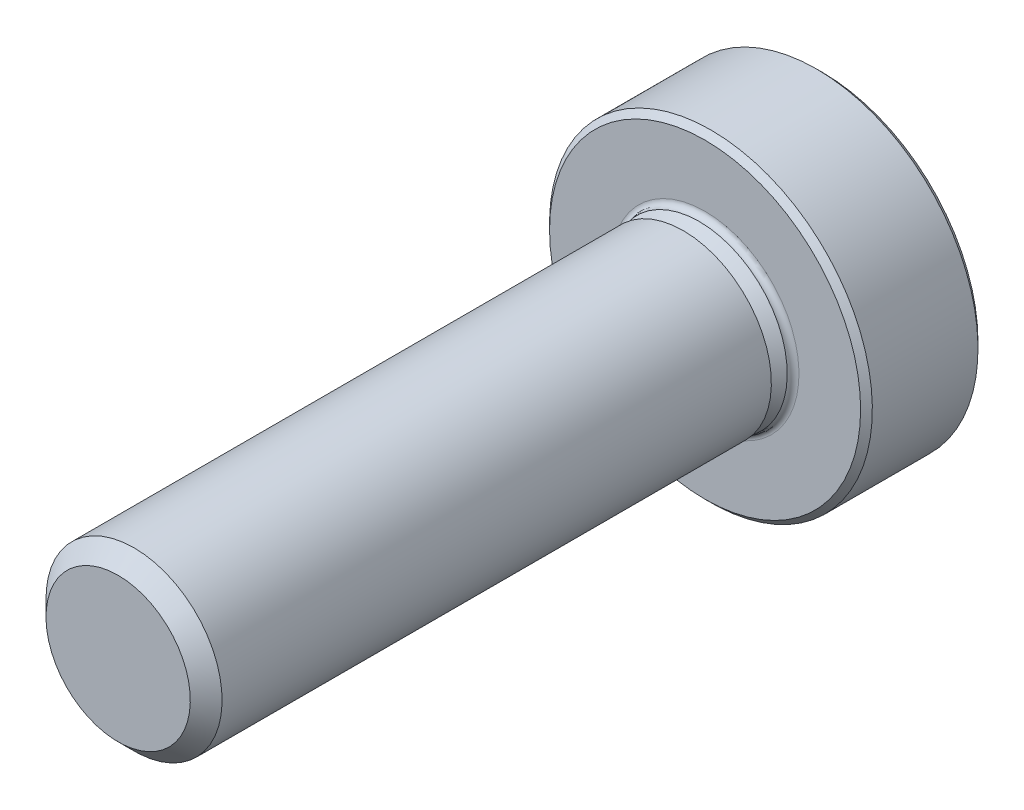
ISO-10303-21;
HEADER;
FILE_DESCRIPTION(('STEP AP214'),'2;1');
FILE_NAME('part.step','',(''),(''),'','','');
FILE_SCHEMA(('AUTOMOTIVE_DESIGN { 1 0 10303 214 1 1 1 1 }'));
ENDSEC;
DATA;
#1=APPLICATION_CONTEXT('core data for automotive mechanical design processes');
#2=APPLICATION_PROTOCOL_DEFINITION('international standard','automotive_design',2000,#1);
#3=PRODUCT_CONTEXT('',#1,'mechanical');
#4=PRODUCT('Part','Part','',(#3));
#5=PRODUCT_RELATED_PRODUCT_CATEGORY('part','',(#4));
#6=PRODUCT_DEFINITION_FORMATION('','',#4);
#7=PRODUCT_DEFINITION_CONTEXT('part definition',#1,'design');
#8=PRODUCT_DEFINITION('design','',#6,#7);
#9=PRODUCT_DEFINITION_SHAPE('','',#8);
#10=(LENGTH_UNIT() NAMED_UNIT(*) SI_UNIT(.MILLI.,.METRE.));
#11=(NAMED_UNIT(*) PLANE_ANGLE_UNIT() SI_UNIT($,.RADIAN.));
#12=(NAMED_UNIT(*) SI_UNIT($,.STERADIAN.) SOLID_ANGLE_UNIT());
#13=UNCERTAINTY_MEASURE_WITH_UNIT(LENGTH_MEASURE(1.E-05),#10,'distance_accuracy_value','');
#14=(GEOMETRIC_REPRESENTATION_CONTEXT(3) GLOBAL_UNCERTAINTY_ASSIGNED_CONTEXT((#13)) GLOBAL_UNIT_ASSIGNED_CONTEXT((#10,
#11,#12)) REPRESENTATION_CONTEXT('',''));
#15=CARTESIAN_POINT('',(0.,0.,0.));
#16=DIRECTION('',(0.,0.,1.));
#17=DIRECTION('',(1.,0.,0.));
#18=AXIS2_PLACEMENT_3D('',#15,#16,#17);
#19=CARTESIAN_POINT('',(0.,0.6146875,10.));
#20=DIRECTION('',(0.,0.,1.));
#21=DIRECTION('',(0.,1.,0.));
#22=AXIS2_PLACEMENT_3D('',#19,#20,#21);
#23=PLANE('',#22);
#24=CARTESIAN_POINT('',(0.,0.,10.));
#25=DIRECTION('',(0.,0.,1.));
#26=DIRECTION('',(0.,1.,0.));
#27=AXIS2_PLACEMENT_3D('',#24,#25,#26);
#28=CIRCLE('',#27,1.229375);
#29=CARTESIAN_POINT('',(0.,1.229375,10.));
#30=VERTEX_POINT('',#29);
#31=EDGE_CURVE('E10',#30,#30,#28,.T.);
#32=ORIENTED_EDGE('',*,*,#31,.T.);
#33=EDGE_LOOP('',(#32));
#34=FACE_BOUND('',#33,.T.);
#35=ADVANCED_FACE('F15',(#34),#23,.T.);
#36=CARTESIAN_POINT('',(0.,0.,9.8646875));
#37=DIRECTION('',(0.,0.,-1.));
#38=DIRECTION('',(0.,1.,0.));
#39=AXIS2_PLACEMENT_3D('',#36,#37,#38);
#40=CONICAL_SURFACE('',#39,1.3646875,0.785398163397447);
#41=CARTESIAN_POINT('',(0.,0.,9.729375));
#42=DIRECTION('',(0.,0.,1.));
#43=DIRECTION('',(0.,1.,0.));
#44=AXIS2_PLACEMENT_3D('',#41,#42,#43);
#45=CIRCLE('',#44,1.5);
#46=CARTESIAN_POINT('',(0.,1.5,9.729375));
#47=VERTEX_POINT('',#46);
#48=EDGE_CURVE('E27',#47,#47,#45,.T.);
#49=ORIENTED_EDGE('',*,*,#48,.T.);
#50=EDGE_LOOP('',(#49));
#51=FACE_BOUND('',#50,.T.);
#52=ORIENTED_EDGE('',*,*,#31,.F.);
#53=EDGE_LOOP('',(#52));
#54=FACE_BOUND('',#53,.T.);
#55=ADVANCED_FACE('F322',(#51,#54),#40,.T.);
#56=CARTESIAN_POINT('',(0.,0.,5.05));
#57=DIRECTION('',(0.,0.,-1.));
#58=DIRECTION('',(0.,1.,0.));
#59=AXIS2_PLACEMENT_3D('',#56,#57,#58);
#60=CYLINDRICAL_SURFACE('',#59,1.5);
#61=CARTESIAN_POINT('',(0.,0.,0.370625));
#62=DIRECTION('',(0.,0.,1.));
#63=DIRECTION('',(0.,1.,0.));
#64=AXIS2_PLACEMENT_3D('',#61,#62,#63);
#65=CIRCLE('',#64,1.5);
#66=CARTESIAN_POINT('',(0.,1.5,0.370625));
#67=VERTEX_POINT('',#66);
#68=EDGE_CURVE('E161',#67,#67,#65,.T.);
#69=ORIENTED_EDGE('',*,*,#68,.T.);
#70=EDGE_LOOP('',(#69));
#71=FACE_BOUND('',#70,.T.);
#72=ORIENTED_EDGE('',*,*,#48,.F.);
#73=EDGE_LOOP('',(#72));
#74=FACE_BOUND('',#73,.T.);
#75=ADVANCED_FACE('F326',(#71,#74),#60,.T.);
#76=CARTESIAN_POINT('',(0.,1.3646875,0.370625));
#77=DIRECTION('',(0.,0.,-1.));
#78=DIRECTION('',(0.,-1.,0.));
#79=AXIS2_PLACEMENT_3D('',#76,#77,#78);
#80=PLANE('',#79);
#81=CARTESIAN_POINT('',(0.,0.,0.370625));
#82=DIRECTION('',(0.,0.,1.));
#83=DIRECTION('',(0.,1.,0.));
#84=AXIS2_PLACEMENT_3D('',#81,#82,#83);
#85=CIRCLE('',#84,1.229375);
#86=CARTESIAN_POINT('',(0.,1.229375,0.370625));
#87=VERTEX_POINT('',#86);
#88=EDGE_CURVE('E154',#87,#87,#85,.T.);
#89=ORIENTED_EDGE('',*,*,#88,.T.);
#90=EDGE_LOOP('',(#89));
#91=FACE_BOUND('',#90,.T.);
#92=ORIENTED_EDGE('',*,*,#68,.F.);
#93=EDGE_LOOP('',(#92));
#94=FACE_BOUND('',#93,.T.);
#95=ADVANCED_FACE('F338',(#91,#94),#80,.T.);
#96=CARTESIAN_POINT('',(0.,0.,0.235312499999997));
#97=DIRECTION('',(0.,0.,-1.));
#98=DIRECTION('',(0.,1.,0.));
#99=AXIS2_PLACEMENT_3D('',#96,#97,#98);
#100=CONICAL_SURFACE('',#99,1.3646875,0.785398163397448);
#101=CARTESIAN_POINT('',(0.,0.,0.0999999999999943));
#102=DIRECTION('',(0.,0.,1.));
#103=DIRECTION('',(0.,1.,0.));
#104=AXIS2_PLACEMENT_3D('',#101,#102,#103);
#105=CIRCLE('',#104,1.5);
#106=CARTESIAN_POINT('',(0.,1.5,0.0999999999999943));
#107=VERTEX_POINT('',#106);
#108=EDGE_CURVE('E151',#107,#107,#105,.T.);
#109=ORIENTED_EDGE('',*,*,#108,.T.);
#110=EDGE_LOOP('',(#109));
#111=FACE_BOUND('',#110,.T.);
#112=ORIENTED_EDGE('',*,*,#88,.F.);
#113=EDGE_LOOP('',(#112));
#114=FACE_BOUND('',#113,.T.);
#115=ADVANCED_FACE('F335',(#111,#114),#100,.T.);
#116=CARTESIAN_POINT('',(0.,0.,0.1));
#117=DIRECTION('',(0.,0.,1.));
#118=DIRECTION('',(1.,0.,0.));
#119=AXIS2_PLACEMENT_3D('',#116,#117,#118);
#120=TOROIDAL_SURFACE('',#119,1.6,0.1);
#121=CARTESIAN_POINT('',(0.,0.,0.));
#122=DIRECTION('',(0.,0.,1.));
#123=DIRECTION('',(0.,1.,0.));
#124=AXIS2_PLACEMENT_3D('',#121,#122,#123);
#125=CIRCLE('',#124,1.6);
#126=CARTESIAN_POINT('',(0.,1.6,0.));
#127=VERTEX_POINT('',#126);
#128=EDGE_CURVE('E147',#127,#127,#125,.T.);
#129=ORIENTED_EDGE('',*,*,#128,.T.);
#130=EDGE_LOOP('',(#129));
#131=FACE_BOUND('',#130,.T.);
#132=ORIENTED_EDGE('',*,*,#108,.F.);
#133=EDGE_LOOP('',(#132));
#134=FACE_BOUND('',#133,.T.);
#135=ADVANCED_FACE('F148',(#131,#134),#120,.F.);
#136=CARTESIAN_POINT('',(0.,2.125,0.));
#137=DIRECTION('',(0.,0.,1.));
#138=DIRECTION('',(0.,1.,0.));
#139=AXIS2_PLACEMENT_3D('',#136,#137,#138);
#140=PLANE('',#139);
#141=CARTESIAN_POINT('',(0.,0.,0.));
#142=DIRECTION('',(0.,0.,1.));
#143=DIRECTION('',(0.,1.,0.));
#144=AXIS2_PLACEMENT_3D('',#141,#142,#143);
#145=CIRCLE('',#144,2.65);
#146=CARTESIAN_POINT('',(0.,2.65,0.));
#147=VERTEX_POINT('',#146);
#148=EDGE_CURVE('E152',#147,#147,#145,.T.);
#149=ORIENTED_EDGE('',*,*,#148,.T.);
#150=EDGE_LOOP('',(#149));
#151=FACE_BOUND('',#150,.T.);
#152=ORIENTED_EDGE('',*,*,#128,.F.);
#153=EDGE_LOOP('',(#152));
#154=FACE_BOUND('',#153,.T.);
#155=ADVANCED_FACE('F342',(#151,#154),#140,.T.);
#156=CARTESIAN_POINT('',(0.,0.,-0.05));
#157=DIRECTION('',(0.,0.,-1.));
#158=DIRECTION('',(0.,1.,0.));
#159=AXIS2_PLACEMENT_3D('',#156,#157,#158);
#160=CONICAL_SURFACE('',#159,2.7,0.785398163397449);
#161=CARTESIAN_POINT('',(0.,0.,-0.1));
#162=DIRECTION('',(0.,0.,1.));
#163=DIRECTION('',(0.,1.,0.));
#164=AXIS2_PLACEMENT_3D('',#161,#162,#163);
#165=CIRCLE('',#164,2.75);
#166=CARTESIAN_POINT('',(0.,2.75,-0.1));
#167=VERTEX_POINT('',#166);
#168=EDGE_CURVE('E156',#167,#167,#165,.T.);
#169=ORIENTED_EDGE('',*,*,#168,.T.);
#170=EDGE_LOOP('',(#169));
#171=FACE_BOUND('',#170,.T.);
#172=ORIENTED_EDGE('',*,*,#148,.F.);
#173=EDGE_LOOP('',(#172));
#174=FACE_BOUND('',#173,.T.);
#175=ADVANCED_FACE('F345',(#171,#174),#160,.T.);
#176=CARTESIAN_POINT('',(0.,0.,-1.));
#177=DIRECTION('',(0.,0.,-1.));
#178=DIRECTION('',(0.,1.,0.));
#179=AXIS2_PLACEMENT_3D('',#176,#177,#178);
#180=CYLINDRICAL_SURFACE('',#179,2.75);
#181=CARTESIAN_POINT('',(0.,0.,-1.9));
#182=DIRECTION('',(0.,0.,1.));
#183=DIRECTION('',(0.,1.,0.));
#184=AXIS2_PLACEMENT_3D('',#181,#182,#183);
#185=CIRCLE('',#184,2.75);
#186=CARTESIAN_POINT('',(0.,2.75,-1.9));
#187=VERTEX_POINT('',#186);
#188=EDGE_CURVE('E168',#187,#187,#185,.T.);
#189=ORIENTED_EDGE('',*,*,#188,.T.);
#190=EDGE_LOOP('',(#189));
#191=FACE_BOUND('',#190,.T.);
#192=ORIENTED_EDGE('',*,*,#168,.F.);
#193=EDGE_LOOP('',(#192));
#194=FACE_BOUND('',#193,.T.);
#195=ADVANCED_FACE('F349',(#191,#194),#180,.T.);
#196=CARTESIAN_POINT('',(0.,0.,-1.95));
#197=DIRECTION('',(0.,0.,1.));
#198=DIRECTION('',(0.,1.,0.));
#199=AXIS2_PLACEMENT_3D('',#196,#197,#198);
#200=CONICAL_SURFACE('',#199,2.7,0.785398163397449);
#201=CARTESIAN_POINT('',(0.,0.,-2.));
#202=DIRECTION('',(0.,0.,1.));
#203=DIRECTION('',(0.,1.,0.));
#204=AXIS2_PLACEMENT_3D('',#201,#202,#203);
#205=CIRCLE('',#204,2.65);
#206=CARTESIAN_POINT('',(0.,2.65,-2.));
#207=VERTEX_POINT('',#206);
#208=EDGE_CURVE('E219',#207,#207,#205,.T.);
#209=ORIENTED_EDGE('',*,*,#208,.T.);
#210=EDGE_LOOP('',(#209));
#211=FACE_BOUND('',#210,.T.);
#212=ORIENTED_EDGE('',*,*,#188,.F.);
#213=EDGE_LOOP('',(#212));
#214=FACE_BOUND('',#213,.T.);
#215=ADVANCED_FACE('F351',(#211,#214),#200,.T.);
#216=CARTESIAN_POINT('',(0.,1.325,-2.));
#217=DIRECTION('',(0.,0.,-1.));
#218=DIRECTION('',(0.,-1.,0.));
#219=AXIS2_PLACEMENT_3D('',#216,#217,#218);
#220=PLANE('',#219);
#221=ORIENTED_EDGE('',*,*,#208,.F.);
#222=EDGE_LOOP('',(#221));
#223=FACE_BOUND('',#222,.T.);
#224=DIRECTION('',(-0.866025403784439,-0.5,0.));
#225=VECTOR('',#224,1.);
#226=CARTESIAN_POINT('',(-0.213129084996405,1.03165040378444,-2.));
#227=LINE('',#226,#225);
#228=CARTESIAN_POINT('',(-0.0196936524466905,1.14333040283783,-2.));
#229=VERTEX_POINT('',#228);
#230=CARTESIAN_POINT('',(-0.980306347553309,0.58872040473105,-2.));
#231=VERTEX_POINT('',#230);
#232=EDGE_CURVE('E162',#229,#231,#227,.T.);
#233=ORIENTED_EDGE('',*,*,#232,.T.);
#234=CARTESIAN_POINT('',(0.,0.,-2.));
#235=DIRECTION('',(0.,0.,1.));
#236=DIRECTION('',(0.,1.,0.));
#237=AXIS2_PLACEMENT_3D('',#234,#235,#236);
#238=CIRCLE('',#237,1.1435);
#239=CARTESIAN_POINT('',(-1.,0.554609998106778,-2.));
#240=VERTEX_POINT('',#239);
#241=EDGE_CURVE('E52',#231,#240,#238,.T.);
#242=ORIENTED_EDGE('',*,*,#241,.T.);
#243=DIRECTION('',(0.,-1.,0.));
#244=VECTOR('',#243,1.);
#245=CARTESIAN_POINT('',(-1.,0.6625,-2.));
#246=LINE('',#245,#244);
#247=CARTESIAN_POINT('',(-1.,-0.554609998106778,-2.));
#248=VERTEX_POINT('',#247);
#249=EDGE_CURVE('E202',#240,#248,#246,.T.);
#250=ORIENTED_EDGE('',*,*,#249,.T.);
#251=CARTESIAN_POINT('',(0.,0.,-2.));
#252=DIRECTION('',(0.,0.,1.));
#253=DIRECTION('',(0.,1.,0.));
#254=AXIS2_PLACEMENT_3D('',#251,#252,#253);
#255=CIRCLE('',#254,1.1435);
#256=CARTESIAN_POINT('',(-0.980306347553309,-0.58872040473105,-2.));
#257=VERTEX_POINT('',#256);
#258=EDGE_CURVE('E215',#248,#257,#255,.T.);
#259=ORIENTED_EDGE('',*,*,#258,.T.);
#260=DIRECTION('',(0.866025403784439,-0.5,0.));
#261=VECTOR('',#260,1.);
#262=CARTESIAN_POINT('',(-0.786870915003595,-0.700400403784438,-2.));
#263=LINE('',#262,#261);
#264=CARTESIAN_POINT('',(-0.0196936524466912,-1.14333040283783,-2.));
#265=VERTEX_POINT('',#264);
#266=EDGE_CURVE('E200',#257,#265,#263,.T.);
#267=ORIENTED_EDGE('',*,*,#266,.T.);
#268=CARTESIAN_POINT('',(0.,0.,-2.));
#269=DIRECTION('',(0.,0.,1.));
#270=DIRECTION('',(0.,1.,0.));
#271=AXIS2_PLACEMENT_3D('',#268,#269,#270);
#272=CIRCLE('',#271,1.1435);
#273=CARTESIAN_POINT('',(0.0196936524466908,-1.14333040283783,-2.));
#274=VERTEX_POINT('',#273);
#275=EDGE_CURVE('E217',#265,#274,#272,.T.);
#276=ORIENTED_EDGE('',*,*,#275,.T.);
#277=DIRECTION('',(0.866025403784439,0.5,0.));
#278=VECTOR('',#277,1.);
#279=CARTESIAN_POINT('',(0.786870915003595,-0.700400403784439,-2.));
#280=LINE('',#279,#278);
#281=CARTESIAN_POINT('',(0.980306347553309,-0.58872040473105,-2.));
#282=VERTEX_POINT('',#281);
#283=EDGE_CURVE('E239',#274,#282,#280,.T.);
#284=ORIENTED_EDGE('',*,*,#283,.T.);
#285=CARTESIAN_POINT('',(0.,0.,-2.));
#286=DIRECTION('',(0.,0.,1.));
#287=DIRECTION('',(0.,1.,0.));
#288=AXIS2_PLACEMENT_3D('',#285,#286,#287);
#289=CIRCLE('',#288,1.1435);
#290=CARTESIAN_POINT('',(1.,-0.554609998106778,-2.));
#291=VERTEX_POINT('',#290);
#292=EDGE_CURVE('E212',#282,#291,#289,.T.);
#293=ORIENTED_EDGE('',*,*,#292,.T.);
#294=DIRECTION('',(0.,1.,0.));
#295=VECTOR('',#294,1.);
#296=CARTESIAN_POINT('',(1.,0.6625,-2.));
#297=LINE('',#296,#295);
#298=CARTESIAN_POINT('',(1.,0.554609998106778,-2.));
#299=VERTEX_POINT('',#298);
#300=EDGE_CURVE('E221',#291,#299,#297,.T.);
#301=ORIENTED_EDGE('',*,*,#300,.T.);
#302=CARTESIAN_POINT('',(0.,0.,-2.));
#303=DIRECTION('',(0.,0.,1.));
#304=DIRECTION('',(0.,1.,0.));
#305=AXIS2_PLACEMENT_3D('',#302,#303,#304);
#306=CIRCLE('',#305,1.1435);
#307=CARTESIAN_POINT('',(0.980306347553309,0.588720404731049,-2.));
#308=VERTEX_POINT('',#307);
#309=EDGE_CURVE('E135',#299,#308,#306,.T.);
#310=ORIENTED_EDGE('',*,*,#309,.T.);
#311=DIRECTION('',(-0.866025403784439,0.5,0.));
#312=VECTOR('',#311,1.);
#313=CARTESIAN_POINT('',(0.213129084996405,1.03165040378444,-2.));
#314=LINE('',#313,#312);
#315=CARTESIAN_POINT('',(0.0196936524466913,1.14333040283783,-2.));
#316=VERTEX_POINT('',#315);
#317=EDGE_CURVE('E173',#308,#316,#314,.T.);
#318=ORIENTED_EDGE('',*,*,#317,.T.);
#319=CARTESIAN_POINT('',(0.,0.,-2.));
#320=DIRECTION('',(0.,0.,1.));
#321=DIRECTION('',(0.,1.,0.));
#322=AXIS2_PLACEMENT_3D('',#319,#320,#321);
#323=CIRCLE('',#322,1.1435);
#324=EDGE_CURVE('E243',#316,#229,#323,.T.);
#325=ORIENTED_EDGE('',*,*,#324,.T.);
#326=EDGE_LOOP('',(#233,#242,#250,#259,#267,#276,#284,#293,#301,#310,#318,#325));
#327=FACE_BOUND('',#326,.T.);
#328=ADVANCED_FACE('F285',(#223,#327),#220,.T.);
#329=CARTESIAN_POINT('',(0.,0.,-1.75));
#330=DIRECTION('',(0.,0.,-1.));
#331=DIRECTION('',(0.,1.,0.));
#332=AXIS2_PLACEMENT_3D('',#329,#330,#331);
#333=CYLINDRICAL_SURFACE('',#332,1.1435);
#334=ORIENTED_EDGE('',*,*,#241,.F.);
#335=DIRECTION('',(0.,0.,1.));
#336=VECTOR('',#335,1.);
#337=CARTESIAN_POINT('',(-0.980306347553309,0.58872040473105,-1.75));
#338=LINE('',#337,#336);
#339=CARTESIAN_POINT('',(-0.980306347553309,0.58872040473105,-0.5));
#340=VERTEX_POINT('',#339);
#341=EDGE_CURVE('E244',#231,#340,#338,.T.);
#342=ORIENTED_EDGE('',*,*,#341,.T.);
#343=CARTESIAN_POINT('',(0.,0.,-0.5));
#344=DIRECTION('',(0.,0.,1.));
#345=DIRECTION('',(0.,1.,0.));
#346=AXIS2_PLACEMENT_3D('',#343,#344,#345);
#347=CIRCLE('',#346,1.1435);
#348=CARTESIAN_POINT('',(-1.,0.554609998106778,-0.5));
#349=VERTEX_POINT('',#348);
#350=EDGE_CURVE('E274',#340,#349,#347,.T.);
#351=ORIENTED_EDGE('',*,*,#350,.T.);
#352=DIRECTION('',(0.,0.,-1.));
#353=VECTOR('',#352,1.);
#354=CARTESIAN_POINT('',(-1.,0.554609998106778,-1.75));
#355=LINE('',#354,#353);
#356=EDGE_CURVE('E182',#349,#240,#355,.T.);
#357=ORIENTED_EDGE('',*,*,#356,.T.);
#358=EDGE_LOOP('',(#334,#342,#351,#357));
#359=FACE_BOUND('',#358,.T.);
#360=ADVANCED_FACE('F362',(#359),#333,.F.);
#361=CARTESIAN_POINT('',(0.,0.,-1.75));
#362=DIRECTION('',(0.,0.,-1.));
#363=DIRECTION('',(0.,1.,0.));
#364=AXIS2_PLACEMENT_3D('',#361,#362,#363);
#365=CYLINDRICAL_SURFACE('',#364,1.1435);
#366=ORIENTED_EDGE('',*,*,#258,.F.);
#367=DIRECTION('',(0.,0.,1.));
#368=VECTOR('',#367,1.);
#369=CARTESIAN_POINT('',(-1.,-0.554609998106778,-1.75));
#370=LINE('',#369,#368);
#371=CARTESIAN_POINT('',(-1.,-0.554609998106778,-0.5));
#372=VERTEX_POINT('',#371);
#373=EDGE_CURVE('E166',#248,#372,#370,.T.);
#374=ORIENTED_EDGE('',*,*,#373,.T.);
#375=CARTESIAN_POINT('',(0.,0.,-0.5));
#376=DIRECTION('',(0.,0.,1.));
#377=DIRECTION('',(0.,1.,0.));
#378=AXIS2_PLACEMENT_3D('',#375,#376,#377);
#379=CIRCLE('',#378,1.1435);
#380=CARTESIAN_POINT('',(-0.980306347553309,-0.58872040473105,-0.5));
#381=VERTEX_POINT('',#380);
#382=EDGE_CURVE('E63',#372,#381,#379,.T.);
#383=ORIENTED_EDGE('',*,*,#382,.T.);
#384=DIRECTION('',(0.,0.,-1.));
#385=VECTOR('',#384,1.);
#386=CARTESIAN_POINT('',(-0.980306347553309,-0.58872040473105,-1.75));
#387=LINE('',#386,#385);
#388=EDGE_CURVE('E206',#381,#257,#387,.T.);
#389=ORIENTED_EDGE('',*,*,#388,.T.);
#390=EDGE_LOOP('',(#366,#374,#383,#389));
#391=FACE_BOUND('',#390,.T.);
#392=ADVANCED_FACE('F359',(#391),#365,.F.);
#393=CARTESIAN_POINT('',(0.,0.,-1.75));
#394=DIRECTION('',(0.,0.,-1.));
#395=DIRECTION('',(0.,1.,0.));
#396=AXIS2_PLACEMENT_3D('',#393,#394,#395);
#397=CYLINDRICAL_SURFACE('',#396,1.1435);
#398=ORIENTED_EDGE('',*,*,#275,.F.);
#399=DIRECTION('',(0.,0.,1.));
#400=VECTOR('',#399,1.);
#401=CARTESIAN_POINT('',(-0.0196936524466912,-1.14333040283783,-1.75));
#402=LINE('',#401,#400);
#403=CARTESIAN_POINT('',(-0.0196936524466911,-1.14333040283783,-0.5));
#404=VERTEX_POINT('',#403);
#405=EDGE_CURVE('E205',#265,#404,#402,.T.);
#406=ORIENTED_EDGE('',*,*,#405,.T.);
#407=CARTESIAN_POINT('',(0.,0.,-0.5));
#408=DIRECTION('',(0.,0.,1.));
#409=DIRECTION('',(0.,1.,0.));
#410=AXIS2_PLACEMENT_3D('',#407,#408,#409);
#411=CIRCLE('',#410,1.1435);
#412=CARTESIAN_POINT('',(0.0196936524466909,-1.14333040283783,-0.5));
#413=VERTEX_POINT('',#412);
#414=EDGE_CURVE('E245',#404,#413,#411,.T.);
#415=ORIENTED_EDGE('',*,*,#414,.T.);
#416=DIRECTION('',(0.,0.,-1.));
#417=VECTOR('',#416,1.);
#418=CARTESIAN_POINT('',(0.0196936524466908,-1.14333040283783,-1.75));
#419=LINE('',#418,#417);
#420=EDGE_CURVE('E193',#413,#274,#419,.T.);
#421=ORIENTED_EDGE('',*,*,#420,.T.);
#422=EDGE_LOOP('',(#398,#406,#415,#421));
#423=FACE_BOUND('',#422,.T.);
#424=ADVANCED_FACE('F17',(#423),#397,.F.);
#425=CARTESIAN_POINT('',(0.,0.,-0.169899983590831));
#426=DIRECTION('',(0.,0.,-1.));
#427=DIRECTION('',(0.,1.,0.));
#428=AXIS2_PLACEMENT_3D('',#425,#426,#427);
#429=CONICAL_SURFACE('',#428,0.57175,1.0471975511966);
#430=CARTESIAN_POINT('',(-0.980306347553309,0.58872040473105,-0.5));
#431=CARTESIAN_POINT('',(-0.5,0.866025403784443,-0.344697447889688));
#432=CARTESIAN_POINT('',(-0.01969365244669,1.14333040283783,-0.5));
#433=(BOUNDED_CURVE() B_SPLINE_CURVE(2,(#430,#431,#432),.UNSPECIFIED.,.F.,
.F.) B_SPLINE_CURVE_WITH_KNOTS((3,3),(0.,1.12152812418295),
.UNSPECIFIED.) CURVE() GEOMETRIC_REPRESENTATION_ITEM() RATIONAL_B_SPLINE_CURVE((1.,1.1435,1.)) REPRESENTATION_ITEM(''));
#434=CARTESIAN_POINT('',(-0.0196936524466904,1.14333040283783,-0.5));
#435=VERTEX_POINT('',#434);
#436=EDGE_CURVE('E165',#340,#435,#433,.T.);
#437=ORIENTED_EDGE('',*,*,#436,.T.);
#438=CARTESIAN_POINT('',(0.,0.,-0.5));
#439=DIRECTION('',(0.,0.,1.));
#440=DIRECTION('',(0.,1.,0.));
#441=AXIS2_PLACEMENT_3D('',#438,#439,#440);
#442=CIRCLE('',#441,1.1435);
#443=CARTESIAN_POINT('',(0.0196936524466914,1.14333040283783,-0.5));
#444=VERTEX_POINT('',#443);
#445=EDGE_CURVE('E201',#444,#435,#442,.T.);
#446=ORIENTED_EDGE('',*,*,#445,.F.);
#447=CARTESIAN_POINT('',(0.01969365244669,1.14333040283783,-0.5));
#448=CARTESIAN_POINT('',(0.5,0.866025403784437,-0.344697447889686));
#449=CARTESIAN_POINT('',(0.980306347553311,0.588720404731048,-0.5));
#450=(BOUNDED_CURVE() B_SPLINE_CURVE(2,(#447,#448,#449),.UNSPECIFIED.,.F.,
.F.) B_SPLINE_CURVE_WITH_KNOTS((3,3),(0.,1.12152812418296),
.UNSPECIFIED.) CURVE() GEOMETRIC_REPRESENTATION_ITEM() RATIONAL_B_SPLINE_CURVE((1.,1.1435,1.)) REPRESENTATION_ITEM(''));
#451=CARTESIAN_POINT('',(0.980306347553309,0.588720404731049,-0.5));
#452=VERTEX_POINT('',#451);
#453=EDGE_CURVE('E169',#444,#452,#450,.T.);
#454=ORIENTED_EDGE('',*,*,#453,.T.);
#455=CARTESIAN_POINT('',(0.,0.,-0.5));
#456=DIRECTION('',(0.,0.,1.));
#457=DIRECTION('',(0.,1.,0.));
#458=AXIS2_PLACEMENT_3D('',#455,#456,#457);
#459=CIRCLE('',#458,1.1435);
#460=CARTESIAN_POINT('',(1.,0.554609998106778,-0.5));
#461=VERTEX_POINT('',#460);
#462=EDGE_CURVE('E141',#461,#452,#459,.T.);
#463=ORIENTED_EDGE('',*,*,#462,.F.);
#464=CARTESIAN_POINT('',(1.,0.554609998106779,-0.5));
#465=CARTESIAN_POINT('',(1.,0.,-0.344697447889686));
#466=CARTESIAN_POINT('',(1.,-0.554609998106779,-0.5));
#467=(BOUNDED_CURVE() B_SPLINE_CURVE(2,(#464,#465,#466),.UNSPECIFIED.,.F.,
.F.) B_SPLINE_CURVE_WITH_KNOTS((3,3),(0.,1.12152812418296),
.UNSPECIFIED.) CURVE() GEOMETRIC_REPRESENTATION_ITEM() RATIONAL_B_SPLINE_CURVE((1.,1.1435,1.)) REPRESENTATION_ITEM(''));
#468=CARTESIAN_POINT('',(1.,-0.554609998106778,-0.5));
#469=VERTEX_POINT('',#468);
#470=EDGE_CURVE('E19',#461,#469,#467,.T.);
#471=ORIENTED_EDGE('',*,*,#470,.T.);
#472=CARTESIAN_POINT('',(0.,0.,-0.5));
#473=DIRECTION('',(0.,0.,1.));
#474=DIRECTION('',(0.,1.,0.));
#475=AXIS2_PLACEMENT_3D('',#472,#473,#474);
#476=CIRCLE('',#475,1.1435);
#477=CARTESIAN_POINT('',(0.980306347553309,-0.58872040473105,-0.5));
#478=VERTEX_POINT('',#477);
#479=EDGE_CURVE('E229',#478,#469,#476,.T.);
#480=ORIENTED_EDGE('',*,*,#479,.F.);
#481=CARTESIAN_POINT('',(0.98030634755331,-0.588720404731049,-0.5));
#482=CARTESIAN_POINT('',(0.5,-0.866025403784438,-0.344697447889686));
#483=CARTESIAN_POINT('',(0.0196936524466898,-1.14333040283783,-0.5));
#484=(BOUNDED_CURVE() B_SPLINE_CURVE(2,(#481,#482,#483),.UNSPECIFIED.,.F.,
.F.) B_SPLINE_CURVE_WITH_KNOTS((3,3),(0.,1.12152812418296),
.UNSPECIFIED.) CURVE() GEOMETRIC_REPRESENTATION_ITEM() RATIONAL_B_SPLINE_CURVE((1.,1.1435,1.)) REPRESENTATION_ITEM(''));
#485=EDGE_CURVE('E187',#478,#413,#484,.T.);
#486=ORIENTED_EDGE('',*,*,#485,.T.);
#487=ORIENTED_EDGE('',*,*,#414,.F.);
#488=CARTESIAN_POINT('',(-0.0196936524466897,-1.14333040283783,-0.5));
#489=CARTESIAN_POINT('',(-0.5,-0.866025403784437,-0.344697447889686));
#490=CARTESIAN_POINT('',(-0.98030634755331,-0.588720404731049,-0.5));
#491=(BOUNDED_CURVE() B_SPLINE_CURVE(2,(#488,#489,#490),.UNSPECIFIED.,.F.,
.F.) B_SPLINE_CURVE_WITH_KNOTS((3,3),(0.,1.12152812418296),
.UNSPECIFIED.) CURVE() GEOMETRIC_REPRESENTATION_ITEM() RATIONAL_B_SPLINE_CURVE((1.,1.1435,1.)) REPRESENTATION_ITEM(''));
#492=EDGE_CURVE('E209',#404,#381,#491,.T.);
#493=ORIENTED_EDGE('',*,*,#492,.T.);
#494=ORIENTED_EDGE('',*,*,#382,.F.);
#495=CARTESIAN_POINT('',(-1.,-0.554609998106779,-0.5));
#496=CARTESIAN_POINT('',(-1.,0.,-0.344697447889686));
#497=CARTESIAN_POINT('',(-1.,0.554609998106779,-0.5));
#498=(BOUNDED_CURVE() B_SPLINE_CURVE(2,(#495,#496,#497),.UNSPECIFIED.,.F.,
.F.) B_SPLINE_CURVE_WITH_KNOTS((3,3),(0.,1.12152812418296),
.UNSPECIFIED.) CURVE() GEOMETRIC_REPRESENTATION_ITEM() RATIONAL_B_SPLINE_CURVE((1.,1.1435,1.)) REPRESENTATION_ITEM(''));
#499=EDGE_CURVE('E178',#372,#349,#498,.T.);
#500=ORIENTED_EDGE('',*,*,#499,.T.);
#501=ORIENTED_EDGE('',*,*,#350,.F.);
#502=EDGE_LOOP('',(#437,#446,#454,#463,#471,#480,#486,#487,#493,#494,#500,#501));
#503=FACE_BOUND('',#502,.T.);
#504=CARTESIAN_POINT('',(0.,0.,0.160200032818338));
#505=VERTEX_POINT('',#504);
#506=VERTEX_LOOP('',#505);
#507=FACE_BOUND('',#506,.T.);
#508=ADVANCED_FACE('F292',(#503,#507),#429,.F.);
#509=CARTESIAN_POINT('',(-0.5,0.866025403784439,-3.));
#510=DIRECTION('',(-0.5,0.866025403784439,0.));
#511=DIRECTION('',(-0.866025403784439,-0.5,0.));
#512=AXIS2_PLACEMENT_3D('',#509,#510,#511);
#513=PLANE('',#512);
#514=ORIENTED_EDGE('',*,*,#232,.F.);
#515=DIRECTION('',(0.,0.,-1.));
#516=VECTOR('',#515,1.);
#517=CARTESIAN_POINT('',(-0.0196936524466905,1.14333040283783,-1.75));
#518=LINE('',#517,#516);
#519=EDGE_CURVE('E194',#435,#229,#518,.T.);
#520=ORIENTED_EDGE('',*,*,#519,.F.);
#521=ORIENTED_EDGE('',*,*,#436,.F.);
#522=ORIENTED_EDGE('',*,*,#341,.F.);
#523=EDGE_LOOP('',(#514,#520,#521,#522));
#524=FACE_BOUND('',#523,.T.);
#525=ADVANCED_FACE('F306',(#524),#513,.F.);
#526=CARTESIAN_POINT('',(-1.,0.,-3.));
#527=DIRECTION('',(-1.,0.,0.));
#528=DIRECTION('',(0.,-1.,0.));
#529=AXIS2_PLACEMENT_3D('',#526,#527,#528);
#530=PLANE('',#529);
#531=ORIENTED_EDGE('',*,*,#249,.F.);
#532=ORIENTED_EDGE('',*,*,#356,.F.);
#533=ORIENTED_EDGE('',*,*,#499,.F.);
#534=ORIENTED_EDGE('',*,*,#373,.F.);
#535=EDGE_LOOP('',(#531,#532,#533,#534));
#536=FACE_BOUND('',#535,.T.);
#537=ADVANCED_FACE('F308',(#536),#530,.F.);
#538=CARTESIAN_POINT('',(-0.5,-0.866025403784439,-3.));
#539=DIRECTION('',(-0.5,-0.866025403784439,0.));
#540=DIRECTION('',(0.866025403784439,-0.5,0.));
#541=AXIS2_PLACEMENT_3D('',#538,#539,#540);
#542=PLANE('',#541);
#543=ORIENTED_EDGE('',*,*,#266,.F.);
#544=ORIENTED_EDGE('',*,*,#388,.F.);
#545=ORIENTED_EDGE('',*,*,#492,.F.);
#546=ORIENTED_EDGE('',*,*,#405,.F.);
#547=EDGE_LOOP('',(#543,#544,#545,#546));
#548=FACE_BOUND('',#547,.T.);
#549=ADVANCED_FACE('F315',(#548),#542,.F.);
#550=CARTESIAN_POINT('',(0.,0.,-1.75));
#551=DIRECTION('',(0.,0.,-1.));
#552=DIRECTION('',(0.,1.,0.));
#553=AXIS2_PLACEMENT_3D('',#550,#551,#552);
#554=CYLINDRICAL_SURFACE('',#553,1.1435);
#555=ORIENTED_EDGE('',*,*,#324,.F.);
#556=DIRECTION('',(0.,0.,1.));
#557=VECTOR('',#556,1.);
#558=CARTESIAN_POINT('',(0.0196936524466913,1.14333040283783,-1.75));
#559=LINE('',#558,#557);
#560=EDGE_CURVE('E172',#316,#444,#559,.T.);
#561=ORIENTED_EDGE('',*,*,#560,.T.);
#562=ORIENTED_EDGE('',*,*,#445,.T.);
#563=ORIENTED_EDGE('',*,*,#519,.T.);
#564=EDGE_LOOP('',(#555,#561,#562,#563));
#565=FACE_BOUND('',#564,.T.);
#566=ADVANCED_FACE('F304',(#565),#554,.F.);
#567=CARTESIAN_POINT('',(0.5,0.866025403784438,-3.));
#568=DIRECTION('',(0.5,0.866025403784439,0.));
#569=DIRECTION('',(-0.866025403784439,0.5,0.));
#570=AXIS2_PLACEMENT_3D('',#567,#568,#569);
#571=PLANE('',#570);
#572=ORIENTED_EDGE('',*,*,#317,.F.);
#573=DIRECTION('',(0.,0.,-1.));
#574=VECTOR('',#573,1.);
#575=CARTESIAN_POINT('',(0.980306347553309,0.588720404731049,-1.75));
#576=LINE('',#575,#574);
#577=EDGE_CURVE('E259',#452,#308,#576,.T.);
#578=ORIENTED_EDGE('',*,*,#577,.F.);
#579=ORIENTED_EDGE('',*,*,#453,.F.);
#580=ORIENTED_EDGE('',*,*,#560,.F.);
#581=EDGE_LOOP('',(#572,#578,#579,#580));
#582=FACE_BOUND('',#581,.T.);
#583=ADVANCED_FACE('F302',(#582),#571,.F.);
#584=CARTESIAN_POINT('',(0.,0.,-1.75));
#585=DIRECTION('',(0.,0.,-1.));
#586=DIRECTION('',(0.,1.,0.));
#587=AXIS2_PLACEMENT_3D('',#584,#585,#586);
#588=CYLINDRICAL_SURFACE('',#587,1.1435);
#589=ORIENTED_EDGE('',*,*,#309,.F.);
#590=DIRECTION('',(0.,0.,1.));
#591=VECTOR('',#590,1.);
#592=CARTESIAN_POINT('',(1.,0.554609998106778,-1.75));
#593=LINE('',#592,#591);
#594=EDGE_CURVE('E227',#299,#461,#593,.T.);
#595=ORIENTED_EDGE('',*,*,#594,.T.);
#596=ORIENTED_EDGE('',*,*,#462,.T.);
#597=ORIENTED_EDGE('',*,*,#577,.T.);
#598=EDGE_LOOP('',(#589,#595,#596,#597));
#599=FACE_BOUND('',#598,.T.);
#600=ADVANCED_FACE('F297',(#599),#588,.F.);
#601=CARTESIAN_POINT('',(1.,0.,-3.));
#602=DIRECTION('',(1.,0.,0.));
#603=DIRECTION('',(0.,1.,0.));
#604=AXIS2_PLACEMENT_3D('',#601,#602,#603);
#605=PLANE('',#604);
#606=ORIENTED_EDGE('',*,*,#300,.F.);
#607=DIRECTION('',(0.,0.,-1.));
#608=VECTOR('',#607,1.);
#609=CARTESIAN_POINT('',(1.,-0.554609998106778,-1.75));
#610=LINE('',#609,#608);
#611=EDGE_CURVE('E223',#469,#291,#610,.T.);
#612=ORIENTED_EDGE('',*,*,#611,.F.);
#613=ORIENTED_EDGE('',*,*,#470,.F.);
#614=ORIENTED_EDGE('',*,*,#594,.F.);
#615=EDGE_LOOP('',(#606,#612,#613,#614));
#616=FACE_BOUND('',#615,.T.);
#617=ADVANCED_FACE('F296',(#616),#605,.F.);
#618=CARTESIAN_POINT('',(0.,0.,-1.75));
#619=DIRECTION('',(0.,0.,-1.));
#620=DIRECTION('',(0.,1.,0.));
#621=AXIS2_PLACEMENT_3D('',#618,#619,#620);
#622=CYLINDRICAL_SURFACE('',#621,1.1435);
#623=ORIENTED_EDGE('',*,*,#292,.F.);
#624=DIRECTION('',(0.,0.,1.));
#625=VECTOR('',#624,1.);
#626=CARTESIAN_POINT('',(0.980306347553309,-0.58872040473105,-1.75));
#627=LINE('',#626,#625);
#628=EDGE_CURVE('E192',#282,#478,#627,.T.);
#629=ORIENTED_EDGE('',*,*,#628,.T.);
#630=ORIENTED_EDGE('',*,*,#479,.T.);
#631=ORIENTED_EDGE('',*,*,#611,.T.);
#632=EDGE_LOOP('',(#623,#629,#630,#631));
#633=FACE_BOUND('',#632,.T.);
#634=ADVANCED_FACE('F291',(#633),#622,.F.);
#635=CARTESIAN_POINT('',(0.5,-0.866025403784439,-3.));
#636=DIRECTION('',(0.5,-0.866025403784439,0.));
#637=DIRECTION('',(0.866025403784439,0.5,0.));
#638=AXIS2_PLACEMENT_3D('',#635,#636,#637);
#639=PLANE('',#638);
#640=ORIENTED_EDGE('',*,*,#283,.F.);
#641=ORIENTED_EDGE('',*,*,#420,.F.);
#642=ORIENTED_EDGE('',*,*,#485,.F.);
#643=ORIENTED_EDGE('',*,*,#628,.F.);
#644=EDGE_LOOP('',(#640,#641,#642,#643));
#645=FACE_BOUND('',#644,.T.);
#646=ADVANCED_FACE('F289',(#645),#639,.F.);
#647=CLOSED_SHELL('',(#35,#55,#75,#95,#115,#135,#155,#175,#195,#215,#328,#360,#392,#424,#508,
#525,#537,#549,#566,#583,#600,#617,#634,#646));
#648=MANIFOLD_SOLID_BREP('B1',#647);
#649=ADVANCED_BREP_SHAPE_REPRESENTATION('',(#18,#648),#14);
#650=SHAPE_DEFINITION_REPRESENTATION(#9,#649);
ENDSEC;
END-ISO-10303-21;
